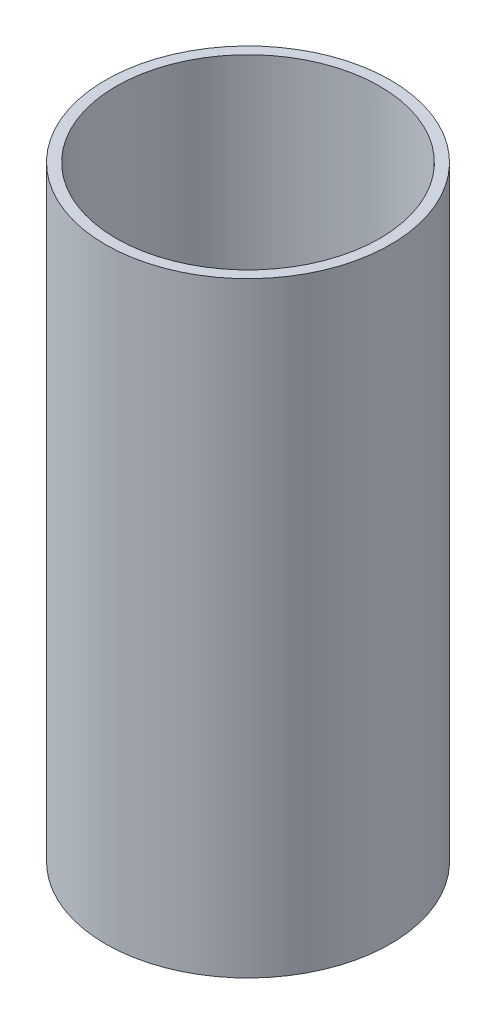
ISO-10303-21;
HEADER;
FILE_DESCRIPTION(('STEP AP214'),'2;1');
FILE_NAME('part.step','',(''),(''),'','','');
FILE_SCHEMA(('AUTOMOTIVE_DESIGN { 1 0 10303 214 1 1 1 1 }'));
ENDSEC;
DATA;
#1=APPLICATION_CONTEXT('core data for automotive mechanical design processes');
#2=APPLICATION_PROTOCOL_DEFINITION('international standard','automotive_design',2000,#1);
#3=PRODUCT_CONTEXT('',#1,'mechanical');
#4=PRODUCT('Part','Part','',(#3));
#5=PRODUCT_RELATED_PRODUCT_CATEGORY('part','',(#4));
#6=PRODUCT_DEFINITION_FORMATION('','',#4);
#7=PRODUCT_DEFINITION_CONTEXT('part definition',#1,'design');
#8=PRODUCT_DEFINITION('design','',#6,#7);
#9=PRODUCT_DEFINITION_SHAPE('','',#8);
#10=(LENGTH_UNIT() NAMED_UNIT(*) SI_UNIT(.MILLI.,.METRE.));
#11=(NAMED_UNIT(*) PLANE_ANGLE_UNIT() SI_UNIT($,.RADIAN.));
#12=(NAMED_UNIT(*) SI_UNIT($,.STERADIAN.) SOLID_ANGLE_UNIT());
#13=UNCERTAINTY_MEASURE_WITH_UNIT(LENGTH_MEASURE(1.E-05),#10,'distance_accuracy_value','');
#14=(GEOMETRIC_REPRESENTATION_CONTEXT(3) GLOBAL_UNCERTAINTY_ASSIGNED_CONTEXT((#13)) GLOBAL_UNIT_ASSIGNED_CONTEXT((#10,
#11,#12)) REPRESENTATION_CONTEXT('',''));
#15=CARTESIAN_POINT('',(0.,0.,0.));
#16=DIRECTION('',(0.,0.,1.));
#17=DIRECTION('',(1.,0.,0.));
#18=AXIS2_PLACEMENT_3D('',#15,#16,#17);
#19=CARTESIAN_POINT('',(0.,5.,0.));
#20=DIRECTION('',(0.,1.,0.));
#21=DIRECTION('',(0.,0.,1.));
#22=AXIS2_PLACEMENT_3D('',#19,#20,#21);
#23=PLANE('',#22);
#24=CARTESIAN_POINT('',(0.398916908497065,5.,16.595357005529));
#25=DIRECTION('',(0.,1.,0.));
#26=DIRECTION('',(0.,0.,1.));
#27=AXIS2_PLACEMENT_3D('',#24,#25,#26);
#28=CIRCLE('',#27,1.90000000000001);
#29=CARTESIAN_POINT('',(2.25443444347127,5.,17.0040802338917));
#30=VERTEX_POINT('',#29);
#31=CARTESIAN_POINT('',(0.469844501519903,5.,18.4941998427255));
#32=VERTEX_POINT('',#31);
#33=EDGE_CURVE('E229',#30,#32,#28,.F.);
#34=ORIENTED_EDGE('',*,*,#33,.T.);
#35=CARTESIAN_POINT('',(0.469848724395843,5.,18.4943668611181));
#36=CARTESIAN_POINT('',(3.89713423204612,5.,18.4100052235027));
#37=CARTESIAN_POINT('',(7.07969530398099,5.,17.09189642034));
#38=CARTESIAN_POINT('',(10.4788490474181,5.,15.6840822822113));
#39=CARTESIAN_POINT('',(13.0815711755286,5.,13.0815711755286));
#40=CARTESIAN_POINT('',(15.683232600443,5.,10.4801206860432));
#41=CARTESIAN_POINT('',(17.09189642034,5.,7.079695303981));
#42=CARTESIAN_POINT('',(18.4999861588976,5.,3.68065571796918));
#43=CARTESIAN_POINT('',(18.5001353735815,5.,0.));
#44=CARTESIAN_POINT('',(18.5001415821043,5.,-0.153144678180571));
#45=CARTESIAN_POINT('',(18.4977073074384,5.,-0.305806615858073));
#46=B_SPLINE_CURVE_WITH_KNOTS('',2,(#35,#36,#37,#38,#39,#40,#41,#42,#43,#44,#45),.UNSPECIFIED.,
.F.,.F.,(3,2,2,2,2,3),(0.00400012680160524,0.0625,0.125,0.1875,0.25,0.252601559466381),.UNSPECIFIED.);
#47=CARTESIAN_POINT('',(18.4975981453206,5.,-0.309440726557622));
#48=VERTEX_POINT('',#47);
#49=EDGE_CURVE('E11',#32,#48,#46,.T.);
#50=ORIENTED_EDGE('',*,*,#49,.T.);
#51=CARTESIAN_POINT('',(16.5977970247013,5.,-0.275511549903154));
#52=DIRECTION('',(0.,1.,0.));
#53=DIRECTION('',(0.,0.,1.));
#54=AXIS2_PLACEMENT_3D('',#51,#52,#53);
#55=CIRCLE('',#54,1.90000000000001);
#56=CARTESIAN_POINT('',(17.0755900825332,5.,1.56343211260737));
#57=VERTEX_POINT('',#56);
#58=EDGE_CURVE('E310',#57,#48,#55,.T.);
#59=ORIENTED_EDGE('',*,*,#58,.F.);
#60=DIRECTION('',(0.967865085531852,0.,-0.251470030437865));
#61=VECTOR('',#60,1.);
#62=CARTESIAN_POINT('',(1.46033437511065,5.,5.62057694274947));
#63=LINE('',#62,#61);
#64=CARTESIAN_POINT('',(7.92865759356696,5.,3.93998172246282));
#65=VERTEX_POINT('',#64);
#66=EDGE_CURVE('E313',#65,#57,#63,.T.);
#67=ORIENTED_EDGE('',*,*,#66,.F.);
#68=CARTESIAN_POINT('',(9.18600774575628,5.,8.77930715012208));
#69=DIRECTION('',(0.,1.,0.));
#70=DIRECTION('',(0.,0.,1.));
#71=AXIS2_PLACEMENT_3D('',#68,#69,#70);
#72=CIRCLE('',#71,5.);
#73=CARTESIAN_POINT('',(4.3030668642452,5.,7.70371970706235));
#74=VERTEX_POINT('',#73);
#75=EDGE_CURVE('E399',#65,#74,#72,.T.);
#76=ORIENTED_EDGE('',*,*,#75,.T.);
#77=DIRECTION('',(-0.215117488611946,0.,0.976588176302217));
#78=VECTOR('',#77,1.);
#79=CARTESIAN_POINT('',(5.72234679655976,5.,1.26048717536552));
#80=LINE('',#79,#78);
#81=EDGE_CURVE('E639',#74,#30,#80,.T.);
#82=ORIENTED_EDGE('',*,*,#81,.T.);
#83=EDGE_LOOP('',(#34,#50,#59,#67,#76,#82));
#84=FACE_BOUND('',#83,.T.);
#85=ADVANCED_FACE('F35',(#84),#23,.T.);
#86=CARTESIAN_POINT('',(16.595357005529,5.,-0.398916908497127));
#87=DIRECTION('',(0.,1.,0.));
#88=DIRECTION('',(0.,0.,1.));
#89=AXIS2_PLACEMENT_3D('',#86,#87,#88);
#90=CIRCLE('',#89,1.90000000000002);
#91=CARTESIAN_POINT('',(17.0040802338917,5.,-2.25443444347133));
#92=VERTEX_POINT('',#91);
#93=CARTESIAN_POINT('',(18.4942082430077,5.,-0.469844686806047));
#94=VERTEX_POINT('',#93);
#95=EDGE_CURVE('E361',#92,#94,#90,.F.);
#96=ORIENTED_EDGE('',*,*,#95,.T.);
#97=CARTESIAN_POINT('',(18.4943836608976,5.,-0.469849126999993));
#98=CARTESIAN_POINT('',(18.4101364550359,5.,-3.896817374775));
#99=CARTESIAN_POINT('',(17.09189642034,5.,-7.07969530398099));
#100=CARTESIAN_POINT('',(15.6840822822053,5.,-10.4788490474242));
#101=CARTESIAN_POINT('',(13.0815711755286,5.,-13.0815711755286));
#102=CARTESIAN_POINT('',(10.4801206860512,5.,-15.683232600435));
#103=CARTESIAN_POINT('',(7.079695303981,5.,-17.09189642034));
#104=CARTESIAN_POINT('',(3.68065571798048,5.,-18.4999861588976));
#105=CARTESIAN_POINT('',(0.,5.,-18.5001353735815));
#106=CARTESIAN_POINT('',(-0.15314467860857,5.,-18.5001415821043));
#107=CARTESIAN_POINT('',(-0.305806616711385,5.,-18.4977073074248));
#108=B_SPLINE_CURVE_WITH_KNOTS('',2,(#97,#98,#99,#100,#101,#102,#103,#104,#105,#106,#107),
.UNSPECIFIED.,.F.,.F.,(3,2,2,2,2,3),(0.254000498511549,0.3125,0.375,0.4375,0.5,
0.502601559473654),.UNSPECIFIED.);
#109=CARTESIAN_POINT('',(-0.309440726984137,5.,-18.4975981453136));
#110=VERTEX_POINT('',#109);
#111=EDGE_CURVE('E46',#94,#110,#108,.T.);
#112=ORIENTED_EDGE('',*,*,#111,.T.);
#113=CARTESIAN_POINT('',(-0.275511549903212,5.,-16.5977970247013));
#114=DIRECTION('',(0.,1.,0.));
#115=DIRECTION('',(0.,0.,1.));
#116=AXIS2_PLACEMENT_3D('',#113,#114,#115);
#117=CIRCLE('',#116,1.90000000000002);
#118=CARTESIAN_POINT('',(1.56343211260731,5.,-17.0755900825332));
#119=VERTEX_POINT('',#118);
#120=EDGE_CURVE('E532',#119,#110,#117,.T.);
#121=ORIENTED_EDGE('',*,*,#120,.F.);
#122=DIRECTION('',(-0.251470030437871,0.,-0.967865085531851));
#123=VECTOR('',#122,1.);
#124=CARTESIAN_POINT('',(5.6205769427495,5.,-1.46033437511069));
#125=LINE('',#124,#123);
#126=CARTESIAN_POINT('',(3.93998172246282,5.,-7.92865759356695));
#127=VERTEX_POINT('',#126);
#128=EDGE_CURVE('E567',#127,#119,#125,.T.);
#129=ORIENTED_EDGE('',*,*,#128,.F.);
#130=CARTESIAN_POINT('',(8.77930715012208,5.,-9.1860077457563));
#131=DIRECTION('',(0.,1.,0.));
#132=DIRECTION('',(0.,0.,1.));
#133=AXIS2_PLACEMENT_3D('',#130,#131,#132);
#134=CIRCLE('',#133,5.);
#135=CARTESIAN_POINT('',(7.70371970706237,5.,-4.30306686424521));
#136=VERTEX_POINT('',#135);
#137=EDGE_CURVE('E397',#127,#136,#134,.T.);
#138=ORIENTED_EDGE('',*,*,#137,.T.);
#139=DIRECTION('',(0.976588176302218,0.,0.215117488611942));
#140=VECTOR('',#139,1.);
#141=CARTESIAN_POINT('',(1.2604871753655,5.,-5.72234679655975));
#142=LINE('',#141,#140);
#143=EDGE_CURVE('E365',#136,#92,#142,.T.);
#144=ORIENTED_EDGE('',*,*,#143,.T.);
#145=EDGE_LOOP('',(#96,#112,#121,#129,#138,#144));
#146=FACE_BOUND('',#145,.T.);
#147=ADVANCED_FACE('F468',(#146),#23,.T.);
#148=CARTESIAN_POINT('',(-0.398916908497125,5.,-16.5953570055291));
#149=DIRECTION('',(0.,1.,0.));
#150=DIRECTION('',(0.,0.,1.));
#151=AXIS2_PLACEMENT_3D('',#148,#149,#150);
#152=CIRCLE('',#151,1.9);
#153=CARTESIAN_POINT('',(-2.25443444347133,5.,-17.0040802338918));
#154=VERTEX_POINT('',#153);
#155=CARTESIAN_POINT('',(-0.469844686811403,5.,-18.4942082430076));
#156=VERTEX_POINT('',#155);
#157=EDGE_CURVE('E531',#154,#156,#152,.F.);
#158=ORIENTED_EDGE('',*,*,#157,.T.);
#159=CARTESIAN_POINT('',(-0.46984912700534,5.,-18.4943836608975));
#160=CARTESIAN_POINT('',(-3.89681737477497,5.,-18.4101364550348));
#161=CARTESIAN_POINT('',(-7.07969530398099,5.,-17.09189642034));
#162=CARTESIAN_POINT('',(-10.4788490474149,5.,-15.6840822822103));
#163=CARTESIAN_POINT('',(-13.0815711755286,5.,-13.0815711755286));
#164=CARTESIAN_POINT('',(-15.683232600451,5.,-10.4801206860394));
#165=CARTESIAN_POINT('',(-17.09189642034,5.,-7.079695303981));
#166=CARTESIAN_POINT('',(-18.4999861588976,5.,-3.68065571795362));
#167=CARTESIAN_POINT('',(-18.5001353735815,5.,0.));
#168=CARTESIAN_POINT('',(-18.5001415821043,5.,0.153144678173017));
#169=CARTESIAN_POINT('',(-18.4977073074387,5.,0.305806615842921));
#170=B_SPLINE_CURVE_WITH_KNOTS('',2,(#159,#160,#161,#162,#163,#164,#165,#166,#167,#168,#169),
.UNSPECIFIED.,.F.,.F.,(3,2,2,2,2,3),(0.504000498511598,0.5625,0.625,0.6875,0.75,
0.752601559466232),.UNSPECIFIED.);
#171=CARTESIAN_POINT('',(-18.4975981453207,5.,0.309440726550006));
#172=VERTEX_POINT('',#171);
#173=EDGE_CURVE('E661',#156,#172,#170,.T.);
#174=ORIENTED_EDGE('',*,*,#173,.T.);
#175=CARTESIAN_POINT('',(-16.5977970247013,5.,0.27551154990327));
#176=DIRECTION('',(0.,1.,0.));
#177=DIRECTION('',(0.,0.,1.));
#178=AXIS2_PLACEMENT_3D('',#175,#176,#177);
#179=CIRCLE('',#178,1.90000000000004);
#180=CARTESIAN_POINT('',(-17.0755900825332,5.,-1.56343211260725));
#181=VERTEX_POINT('',#180);
#182=EDGE_CURVE('E648',#181,#172,#179,.T.);
#183=ORIENTED_EDGE('',*,*,#182,.F.);
#184=DIRECTION('',(-0.967865085531849,0.,0.251470030437875));
#185=VECTOR('',#184,1.);
#186=CARTESIAN_POINT('',(-1.46033437511072,5.,-5.62057694274951));
#187=LINE('',#186,#185);
#188=CARTESIAN_POINT('',(-7.92865759356693,5.,-3.93998172246281));
#189=VERTEX_POINT('',#188);
#190=EDGE_CURVE('E538',#189,#181,#187,.T.);
#191=ORIENTED_EDGE('',*,*,#190,.F.);
#192=CARTESIAN_POINT('',(-9.18600774575631,5.,-8.77930715012206));
#193=DIRECTION('',(0.,1.,0.));
#194=DIRECTION('',(0.,0.,1.));
#195=AXIS2_PLACEMENT_3D('',#192,#193,#194);
#196=CIRCLE('',#195,5.);
#197=CARTESIAN_POINT('',(-4.30306686424522,5.,-7.70371970706236));
#198=VERTEX_POINT('',#197);
#199=EDGE_CURVE('E401',#189,#198,#196,.T.);
#200=ORIENTED_EDGE('',*,*,#199,.T.);
#201=DIRECTION('',(0.215117488611941,0.,-0.976588176302218));
#202=VECTOR('',#201,1.);
#203=CARTESIAN_POINT('',(-5.72234679655975,5.,-1.26048717536549));
#204=LINE('',#203,#202);
#205=EDGE_CURVE('E534',#198,#154,#204,.T.);
#206=ORIENTED_EDGE('',*,*,#205,.T.);
#207=EDGE_LOOP('',(#158,#174,#183,#191,#200,#206));
#208=FACE_BOUND('',#207,.T.);
#209=ADVANCED_FACE('F475',(#208),#23,.T.);
#210=CARTESIAN_POINT('',(-16.5953570055291,5.,0.398916908497061));
#211=DIRECTION('',(0.,1.,0.));
#212=DIRECTION('',(0.,0.,1.));
#213=AXIS2_PLACEMENT_3D('',#210,#211,#212);
#214=CIRCLE('',#213,1.90000000000001);
#215=CARTESIAN_POINT('',(-17.0040802338918,5.,2.25443444347127));
#216=VERTEX_POINT('',#215);
#217=CARTESIAN_POINT('',(-18.4950051459864,5.00000000000001,0.439698565779146));
#218=VERTEX_POINT('',#217);
#219=EDGE_CURVE('E494',#216,#218,#214,.F.);
#220=ORIENTED_EDGE('',*,*,#219,.T.);
#221=CARTESIAN_POINT('',(-18.495174579785,5.,0.436481423164717));
#222=CARTESIAN_POINT('',(-18.4119243450738,5.,4.08413422044468));
#223=CARTESIAN_POINT('',(-16.9334326102457,5.,7.45117091445404));
#224=CARTESIAN_POINT('',(-15.4662980923971,5.,10.7923432999854));
#225=CARTESIAN_POINT('',(-12.8165681772887,5.,13.3415071287079));
#226=CARTESIAN_POINT('',(-10.1862268144008,5.,15.872018265422));
#227=CARTESIAN_POINT('',(-6.76576815431525,5.,17.2187060575788));
#228=CARTESIAN_POINT('',(-3.36810624443425,5.,18.5564184144937));
#229=CARTESIAN_POINT('',(0.305878855076814,5.,18.4976947119114));
#230=B_SPLINE_CURVE_WITH_KNOTS('',2,(#221,#222,#223,#224,#225,#226,#227,#228,#229),
.UNSPECIFIED.,.F.,.F.,(3,2,2,2,3),(0.,0.25,0.5,0.75,1.),.UNSPECIFIED.);
#231=CARTESIAN_POINT('',(0.309476782501093,5.,18.4975917693016));
#232=VERTEX_POINT('',#231);
#233=EDGE_CURVE('E426',#218,#232,#230,.T.);
#234=ORIENTED_EDGE('',*,*,#233,.T.);
#235=CARTESIAN_POINT('',(0.275511549903097,5.,16.5977970247013));
#236=DIRECTION('',(0.,1.,0.));
#237=DIRECTION('',(0.,0.,1.));
#238=AXIS2_PLACEMENT_3D('',#235,#236,#237);
#239=CIRCLE('',#238,1.89999999999999);
#240=CARTESIAN_POINT('',(-1.56343211260743,5.,17.0755900825332));
#241=VERTEX_POINT('',#240);
#242=EDGE_CURVE('E246',#241,#232,#239,.T.);
#243=ORIENTED_EDGE('',*,*,#242,.F.);
#244=DIRECTION('',(0.251470030437862,0.,0.967865085531853));
#245=VECTOR('',#244,1.);
#246=CARTESIAN_POINT('',(-5.62057694274948,5.,1.46033437511063));
#247=LINE('',#246,#245);
#248=CARTESIAN_POINT('',(-3.93998172246285,5.,7.92865759356695));
#249=VERTEX_POINT('',#248);
#250=EDGE_CURVE('E646',#249,#241,#247,.T.);
#251=ORIENTED_EDGE('',*,*,#250,.F.);
#252=CARTESIAN_POINT('',(-8.77930715012212,5.,9.18600774575627));
#253=DIRECTION('',(0.,1.,0.));
#254=DIRECTION('',(0.,0.,1.));
#255=AXIS2_PLACEMENT_3D('',#252,#253,#254);
#256=CIRCLE('',#255,5.);
#257=CARTESIAN_POINT('',(-7.7037197070624,5.,4.30306686424518));
#258=VERTEX_POINT('',#257);
#259=EDGE_CURVE('E403',#249,#258,#256,.T.);
#260=ORIENTED_EDGE('',*,*,#259,.T.);
#261=DIRECTION('',(-0.976588176302217,0.,-0.215117488611944));
#262=VECTOR('',#261,1.);
#263=CARTESIAN_POINT('',(-1.26048717536551,5.,5.72234679655974));
#264=LINE('',#263,#262);
#265=EDGE_CURVE('E499',#258,#216,#264,.T.);
#266=ORIENTED_EDGE('',*,*,#265,.T.);
#267=EDGE_LOOP('',(#220,#234,#243,#251,#260,#266));
#268=FACE_BOUND('',#267,.T.);
#269=ADVANCED_FACE('F470',(#268),#23,.T.);
#270=CARTESIAN_POINT('',(0.,2.5,0.));
#271=DIRECTION('',(0.,1.,0.));
#272=DIRECTION('',(0.,0.,1.));
#273=AXIS2_PLACEMENT_3D('',#270,#271,#272);
#274=PLANE('',#273);
#275=CARTESIAN_POINT('',(0.,2.5,0.));
#276=DIRECTION('',(0.,1.,0.));
#277=DIRECTION('',(0.,0.,1.));
#278=AXIS2_PLACEMENT_3D('',#275,#276,#277);
#279=CIRCLE('',#278,4.7);
#280=CARTESIAN_POINT('',(0.,2.5,4.7));
#281=VERTEX_POINT('',#280);
#282=EDGE_CURVE('E382',#281,#281,#279,.T.);
#283=ORIENTED_EDGE('',*,*,#282,.F.);
#284=EDGE_LOOP('',(#283));
#285=FACE_BOUND('',#284,.T.);
#286=DIRECTION('',(0.976588176302218,0.,0.215117488611942));
#287=VECTOR('',#286,1.);
#288=CARTESIAN_POINT('',(1.2604871753655,2.5,-5.72234679655975));
#289=LINE('',#288,#287);
#290=CARTESIAN_POINT('',(7.70371970706237,2.5,-4.30306686424521));
#291=VERTEX_POINT('',#290);
#292=CARTESIAN_POINT('',(17.0040802338917,2.5,-2.25443444347133));
#293=VERTEX_POINT('',#292);
#294=EDGE_CURVE('E579',#291,#293,#289,.T.);
#295=ORIENTED_EDGE('',*,*,#294,.F.);
#296=CARTESIAN_POINT('',(8.77930715012208,2.5,-9.1860077457563));
#297=DIRECTION('',(0.,1.,0.));
#298=DIRECTION('',(0.,0.,1.));
#299=AXIS2_PLACEMENT_3D('',#296,#297,#298);
#300=CIRCLE('',#299,5.);
#301=CARTESIAN_POINT('',(3.93998172246282,2.5,-7.92865759356695));
#302=VERTEX_POINT('',#301);
#303=EDGE_CURVE('E53',#291,#302,#300,.F.);
#304=ORIENTED_EDGE('',*,*,#303,.T.);
#305=DIRECTION('',(-0.251470030437871,0.,-0.967865085531851));
#306=VECTOR('',#305,1.);
#307=CARTESIAN_POINT('',(5.6205769427495,2.5,-1.46033437511069));
#308=LINE('',#307,#306);
#309=CARTESIAN_POINT('',(1.56343211260731,2.5,-17.0755900825332));
#310=VERTEX_POINT('',#309);
#311=EDGE_CURVE('E623',#302,#310,#308,.T.);
#312=ORIENTED_EDGE('',*,*,#311,.T.);
#313=CARTESIAN_POINT('',(-0.275511549903212,2.5,-16.5977970247013));
#314=DIRECTION('',(0.,1.,0.));
#315=DIRECTION('',(0.,0.,1.));
#316=AXIS2_PLACEMENT_3D('',#313,#314,#315);
#317=CIRCLE('',#316,1.90000000000002);
#318=CARTESIAN_POINT('',(-0.31307175411364,2.5,-18.4974257334388));
#319=VERTEX_POINT('',#318);
#320=EDGE_CURVE('E621',#310,#319,#317,.T.);
#321=ORIENTED_EDGE('',*,*,#320,.T.);
#322=DIRECTION('',(0.999804583546048,0.,-0.0197685285318369));
#323=VECTOR('',#322,1.);
#324=CARTESIAN_POINT('',(-0.365717777838952,2.5,-18.4963847956003));
#325=LINE('',#324,#323);
#326=CARTESIAN_POINT('',(-0.365717777839752,2.5,-18.4963847956003));
#327=VERTEX_POINT('',#326);
#328=EDGE_CURVE('E618',#327,#319,#325,.T.);
#329=ORIENTED_EDGE('',*,*,#328,.F.);
#330=CARTESIAN_POINT('',(0.,2.5,0.));
#331=DIRECTION('',(0.,1.,0.));
#332=DIRECTION('',(0.,0.,1.));
#333=AXIS2_PLACEMENT_3D('',#330,#331,#332);
#334=CIRCLE('',#333,18.5);
#335=CARTESIAN_POINT('',(-0.469840502049203,2.5,-18.4940328187941));
#336=VERTEX_POINT('',#335);
#337=EDGE_CURVE('E587',#327,#336,#334,.T.);
#338=ORIENTED_EDGE('',*,*,#337,.T.);
#339=CARTESIAN_POINT('',(-0.398916908497125,2.5,-16.5953570055291));
#340=DIRECTION('',(0.,1.,0.));
#341=DIRECTION('',(0.,0.,1.));
#342=AXIS2_PLACEMENT_3D('',#339,#340,#341);
#343=CIRCLE('',#342,1.9);
#344=CARTESIAN_POINT('',(-2.25443444347133,2.5,-17.0040802338918));
#345=VERTEX_POINT('',#344);
#346=EDGE_CURVE('E616',#345,#336,#343,.F.);
#347=ORIENTED_EDGE('',*,*,#346,.F.);
#348=DIRECTION('',(0.215117488611941,0.,-0.976588176302218));
#349=VECTOR('',#348,1.);
#350=CARTESIAN_POINT('',(-5.72234679655975,2.5,-1.26048717536549));
#351=LINE('',#350,#349);
#352=CARTESIAN_POINT('',(-4.30306686424522,2.5,-7.70371970706236));
#353=VERTEX_POINT('',#352);
#354=EDGE_CURVE('E614',#353,#345,#351,.T.);
#355=ORIENTED_EDGE('',*,*,#354,.F.);
#356=CARTESIAN_POINT('',(-9.18600774575631,2.5,-8.77930715012206));
#357=DIRECTION('',(0.,1.,0.));
#358=DIRECTION('',(0.,0.,1.));
#359=AXIS2_PLACEMENT_3D('',#356,#357,#358);
#360=CIRCLE('',#359,5.);
#361=CARTESIAN_POINT('',(-7.92865759356693,2.5,-3.93998172246281));
#362=VERTEX_POINT('',#361);
#363=EDGE_CURVE('E421',#353,#362,#360,.F.);
#364=ORIENTED_EDGE('',*,*,#363,.T.);
#365=DIRECTION('',(-0.967865085531849,0.,0.251470030437875));
#366=VECTOR('',#365,1.);
#367=CARTESIAN_POINT('',(-1.46033437511072,2.5,-5.62057694274951));
#368=LINE('',#367,#366);
#369=CARTESIAN_POINT('',(-17.0755900825332,2.5,-1.56343211260725));
#370=VERTEX_POINT('',#369);
#371=EDGE_CURVE('E612',#362,#370,#368,.T.);
#372=ORIENTED_EDGE('',*,*,#371,.T.);
#373=CARTESIAN_POINT('',(-16.5977970247013,2.5,0.27551154990327));
#374=DIRECTION('',(0.,1.,0.));
#375=DIRECTION('',(0.,0.,1.));
#376=AXIS2_PLACEMENT_3D('',#373,#374,#375);
#377=CIRCLE('',#376,1.90000000000004);
#378=CARTESIAN_POINT('',(-18.4974257334388,2.5,0.313071754113599));
#379=VERTEX_POINT('',#378);
#380=EDGE_CURVE('E610',#370,#379,#377,.T.);
#381=ORIENTED_EDGE('',*,*,#380,.T.);
#382=DIRECTION('',(0.0197685285318852,0.,0.999804583546047));
#383=VECTOR('',#382,1.);
#384=CARTESIAN_POINT('',(-18.4963847956003,2.5,0.365717777839846));
#385=LINE('',#384,#383);
#386=CARTESIAN_POINT('',(-18.4949857142666,2.5,0.436477112707738));
#387=VERTEX_POINT('',#386);
#388=EDGE_CURVE('E608',#379,#387,#385,.T.);
#389=ORIENTED_EDGE('',*,*,#388,.T.);
#390=CARTESIAN_POINT('',(-16.5953570055291,2.5,0.398916908497061));
#391=DIRECTION('',(0.,1.,0.));
#392=DIRECTION('',(0.,0.,1.));
#393=AXIS2_PLACEMENT_3D('',#390,#391,#392);
#394=CIRCLE('',#393,1.90000000000001);
#395=CARTESIAN_POINT('',(-17.0040802338918,2.5,2.25443444347127));
#396=VERTEX_POINT('',#395);
#397=EDGE_CURVE('E506',#396,#387,#394,.F.);
#398=ORIENTED_EDGE('',*,*,#397,.F.);
#399=DIRECTION('',(-0.976588176302217,0.,-0.215117488611944));
#400=VECTOR('',#399,1.);
#401=CARTESIAN_POINT('',(-1.26048717536551,2.5,5.72234679655974));
#402=LINE('',#401,#400);
#403=CARTESIAN_POINT('',(-7.7037197070624,2.5,4.30306686424518));
#404=VERTEX_POINT('',#403);
#405=EDGE_CURVE('E605',#404,#396,#402,.T.);
#406=ORIENTED_EDGE('',*,*,#405,.F.);
#407=CARTESIAN_POINT('',(-8.77930715012212,2.5,9.18600774575627));
#408=DIRECTION('',(0.,1.,0.));
#409=DIRECTION('',(0.,0.,1.));
#410=AXIS2_PLACEMENT_3D('',#407,#408,#409);
#411=CIRCLE('',#410,5.);
#412=CARTESIAN_POINT('',(-3.93998172246285,2.5,7.92865759356695));
#413=VERTEX_POINT('',#412);
#414=EDGE_CURVE('E419',#404,#413,#411,.F.);
#415=ORIENTED_EDGE('',*,*,#414,.T.);
#416=DIRECTION('',(0.251470030437862,0.,0.967865085531853));
#417=VECTOR('',#416,1.);
#418=CARTESIAN_POINT('',(-5.62057694274948,2.5,1.46033437511063));
#419=LINE('',#418,#417);
#420=CARTESIAN_POINT('',(-1.56343211260743,2.5,17.0755900825332));
#421=VERTEX_POINT('',#420);
#422=EDGE_CURVE('E603',#413,#421,#419,.T.);
#423=ORIENTED_EDGE('',*,*,#422,.T.);
#424=CARTESIAN_POINT('',(0.275511549903097,2.5,16.5977970247013));
#425=DIRECTION('',(0.,1.,0.));
#426=DIRECTION('',(0.,0.,1.));
#427=AXIS2_PLACEMENT_3D('',#424,#425,#426);
#428=CIRCLE('',#427,1.89999999999999);
#429=CARTESIAN_POINT('',(0.313071754113643,2.5,18.4974257334387));
#430=VERTEX_POINT('',#429);
#431=EDGE_CURVE('E601',#421,#430,#428,.T.);
#432=ORIENTED_EDGE('',*,*,#431,.T.);
#433=DIRECTION('',(-0.999804583546048,0.,0.0197685285318369));
#434=VECTOR('',#433,1.);
#435=CARTESIAN_POINT('',(0.365717777838951,2.5,18.4963847956003));
#436=LINE('',#435,#434);
#437=CARTESIAN_POINT('',(0.365717777839755,2.5,18.4963847956002));
#438=VERTEX_POINT('',#437);
#439=EDGE_CURVE('E599',#438,#430,#436,.T.);
#440=ORIENTED_EDGE('',*,*,#439,.F.);
#441=CARTESIAN_POINT('',(0.469840502041634,2.5,18.4940328187943));
#442=VERTEX_POINT('',#441);
#443=EDGE_CURVE('E235',#438,#442,#334,.T.);
#444=ORIENTED_EDGE('',*,*,#443,.T.);
#445=CARTESIAN_POINT('',(0.398916908497065,2.5,16.595357005529));
#446=DIRECTION('',(0.,1.,0.));
#447=DIRECTION('',(0.,0.,1.));
#448=AXIS2_PLACEMENT_3D('',#445,#446,#447);
#449=CIRCLE('',#448,1.90000000000001);
#450=CARTESIAN_POINT('',(2.25443444347127,2.5,17.0040802338917));
#451=VERTEX_POINT('',#450);
#452=EDGE_CURVE('E596',#451,#442,#449,.F.);
#453=ORIENTED_EDGE('',*,*,#452,.F.);
#454=DIRECTION('',(-0.215117488611946,0.,0.976588176302217));
#455=VECTOR('',#454,1.);
#456=CARTESIAN_POINT('',(5.72234679655976,2.5,1.26048717536552));
#457=LINE('',#456,#455);
#458=CARTESIAN_POINT('',(4.3030668642452,2.5,7.70371970706235));
#459=VERTEX_POINT('',#458);
#460=EDGE_CURVE('E594',#459,#451,#457,.T.);
#461=ORIENTED_EDGE('',*,*,#460,.F.);
#462=CARTESIAN_POINT('',(9.18600774575628,2.5,8.77930715012208));
#463=DIRECTION('',(0.,1.,0.));
#464=DIRECTION('',(0.,0.,1.));
#465=AXIS2_PLACEMENT_3D('',#462,#463,#464);
#466=CIRCLE('',#465,5.);
#467=CARTESIAN_POINT('',(7.92865759356696,2.5,3.93998172246282));
#468=VERTEX_POINT('',#467);
#469=EDGE_CURVE('E423',#459,#468,#466,.F.);
#470=ORIENTED_EDGE('',*,*,#469,.T.);
#471=DIRECTION('',(0.967865085531852,0.,-0.251470030437865));
#472=VECTOR('',#471,1.);
#473=CARTESIAN_POINT('',(1.46033437511065,2.5,5.62057694274947));
#474=LINE('',#473,#472);
#475=CARTESIAN_POINT('',(17.0755900825332,2.5,1.56343211260737));
#476=VERTEX_POINT('',#475);
#477=EDGE_CURVE('E592',#468,#476,#474,.T.);
#478=ORIENTED_EDGE('',*,*,#477,.T.);
#479=CARTESIAN_POINT('',(16.5977970247013,2.5,-0.275511549903154));
#480=DIRECTION('',(0.,1.,0.));
#481=DIRECTION('',(0.,0.,1.));
#482=AXIS2_PLACEMENT_3D('',#479,#480,#481);
#483=CIRCLE('',#482,1.90000000000001);
#484=CARTESIAN_POINT('',(18.4974257334388,2.5,-0.313071754113674));
#485=VERTEX_POINT('',#484);
#486=EDGE_CURVE('E590',#476,#485,#483,.T.);
#487=ORIENTED_EDGE('',*,*,#486,.T.);
#488=DIRECTION('',(0.0197685285318369,0.,0.999804583546048));
#489=VECTOR('',#488,1.);
#490=CARTESIAN_POINT('',(18.4963847956003,2.5,-0.365717777838952));
#491=LINE('',#490,#489);
#492=CARTESIAN_POINT('',(18.4963847956003,2.5,-0.365717777839786));
#493=VERTEX_POINT('',#492);
#494=EDGE_CURVE('E586',#493,#485,#491,.T.);
#495=ORIENTED_EDGE('',*,*,#494,.F.);
#496=CARTESIAN_POINT('',(18.4940328187943,2.5,-0.469840502043847));
#497=VERTEX_POINT('',#496);
#498=EDGE_CURVE('E584',#493,#497,#334,.T.);
#499=ORIENTED_EDGE('',*,*,#498,.T.);
#500=CARTESIAN_POINT('',(16.595357005529,2.5,-0.398916908497127));
#501=DIRECTION('',(0.,1.,0.));
#502=DIRECTION('',(0.,0.,1.));
#503=AXIS2_PLACEMENT_3D('',#500,#501,#502);
#504=CIRCLE('',#503,1.90000000000002);
#505=EDGE_CURVE('E581',#293,#497,#504,.F.);
#506=ORIENTED_EDGE('',*,*,#505,.F.);
#507=EDGE_LOOP('',(#295,#304,#312,#321,#329,#338,#347,#355,#364,#372,#381,#389,#398,#406,#415,
#423,#432,#440,#444,#453,#461,#470,#478,#487,#495,#499,#506));
#508=FACE_BOUND('',#507,.T.);
#509=ADVANCED_FACE('F481',(#285,#508),#274,.T.);
#510=CARTESIAN_POINT('',(0.,0.,0.));
#511=DIRECTION('',(0.,1.,0.));
#512=DIRECTION('',(0.,0.,1.));
#513=AXIS2_PLACEMENT_3D('',#510,#511,#512);
#514=PLANE('',#513);
#515=CARTESIAN_POINT('',(0.,0.,0.));
#516=DIRECTION('',(0.,1.,0.));
#517=DIRECTION('',(0.,0.,1.));
#518=AXIS2_PLACEMENT_3D('',#515,#516,#517);
#519=CIRCLE('',#518,20.);
#520=CARTESIAN_POINT('',(0.,0.,20.));
#521=VERTEX_POINT('',#520);
#522=EDGE_CURVE('E388',#521,#521,#519,.T.);
#523=ORIENTED_EDGE('',*,*,#522,.F.);
#524=EDGE_LOOP('',(#523));
#525=FACE_BOUND('',#524,.T.);
#526=CARTESIAN_POINT('',(0.,0.,0.));
#527=DIRECTION('',(0.,1.,0.));
#528=DIRECTION('',(0.,0.,1.));
#529=AXIS2_PLACEMENT_3D('',#526,#527,#528);
#530=CIRCLE('',#529,4.7);
#531=CARTESIAN_POINT('',(0.,0.,4.7));
#532=VERTEX_POINT('',#531);
#533=EDGE_CURVE('E376',#532,#532,#530,.T.);
#534=ORIENTED_EDGE('',*,*,#533,.T.);
#535=EDGE_LOOP('',(#534));
#536=FACE_BOUND('',#535,.T.);
#537=ADVANCED_FACE('F488',(#525,#536),#514,.F.);
#538=CARTESIAN_POINT('',(0.,2.5,0.));
#539=DIRECTION('',(0.,-1.,0.));
#540=DIRECTION('',(0.,0.,-1.));
#541=AXIS2_PLACEMENT_3D('',#538,#539,#540);
#542=CYLINDRICAL_SURFACE('',#541,20.);
#543=ORIENTED_EDGE('',*,*,#522,.T.);
#544=EDGE_LOOP('',(#543));
#545=FACE_BOUND('',#544,.T.);
#546=CARTESIAN_POINT('',(0.,85.,0.));
#547=DIRECTION('',(0.,1.,0.));
#548=DIRECTION('',(0.,0.,1.));
#549=AXIS2_PLACEMENT_3D('',#546,#547,#548);
#550=CIRCLE('',#549,20.);
#551=CARTESIAN_POINT('',(0.,85.,20.));
#552=VERTEX_POINT('',#551);
#553=EDGE_CURVE('E582',#552,#552,#550,.T.);
#554=ORIENTED_EDGE('',*,*,#553,.F.);
#555=EDGE_LOOP('',(#554));
#556=FACE_BOUND('',#555,.T.);
#557=ADVANCED_FACE('F795',(#545,#556),#542,.T.);
#558=CARTESIAN_POINT('',(0.,2.5,0.));
#559=DIRECTION('',(0.,-1.,0.));
#560=DIRECTION('',(0.,0.,-1.));
#561=AXIS2_PLACEMENT_3D('',#558,#559,#560);
#562=CYLINDRICAL_SURFACE('',#561,4.7);
#563=ORIENTED_EDGE('',*,*,#282,.T.);
#564=EDGE_LOOP('',(#563));
#565=FACE_BOUND('',#564,.T.);
#566=ORIENTED_EDGE('',*,*,#533,.F.);
#567=EDGE_LOOP('',(#566));
#568=FACE_BOUND('',#567,.T.);
#569=ADVANCED_FACE('F860',(#565,#568),#562,.F.);
#570=CARTESIAN_POINT('',(1.2604871753655,5.,-5.72234679655975));
#571=DIRECTION('',(0.215117488611942,0.,-0.976588176302218));
#572=DIRECTION('',(-0.976588176302218,0.,-0.215117488611942));
#573=AXIS2_PLACEMENT_3D('',#570,#571,#572);
#574=PLANE('',#573);
#575=ORIENTED_EDGE('',*,*,#143,.F.);
#576=DIRECTION('',(0.,-1.,0.));
#577=VECTOR('',#576,1.);
#578=CARTESIAN_POINT('',(7.70371970706237,2.5,-4.30306686424521));
#579=LINE('',#578,#577);
#580=EDGE_CURVE('E415',#136,#291,#579,.T.);
#581=ORIENTED_EDGE('',*,*,#580,.T.);
#582=ORIENTED_EDGE('',*,*,#294,.T.);
#583=DIRECTION('',(0.,-1.,0.));
#584=VECTOR('',#583,1.);
#585=CARTESIAN_POINT('',(17.0040802338917,5.,-2.25443444347133));
#586=LINE('',#585,#584);
#587=EDGE_CURVE('E369',#92,#293,#586,.T.);
#588=ORIENTED_EDGE('',*,*,#587,.F.);
#589=EDGE_LOOP('',(#575,#581,#582,#588));
#590=FACE_BOUND('',#589,.T.);
#591=ADVANCED_FACE('F757',(#590),#574,.F.);
#592=CARTESIAN_POINT('',(16.595357005529,5.,-0.398916908497127));
#593=DIRECTION('',(0.,-1.,0.));
#594=DIRECTION('',(0.,0.,-1.));
#595=AXIS2_PLACEMENT_3D('',#592,#593,#594);
#596=CYLINDRICAL_SURFACE('',#595,1.90000000000002);
#597=ORIENTED_EDGE('',*,*,#505,.T.);
#598=DIRECTION('',(0.,-1.,0.));
#599=VECTOR('',#598,1.);
#600=CARTESIAN_POINT('',(18.4940328187943,5.,-0.469840502043847));
#601=LINE('',#600,#599);
#602=EDGE_CURVE('E358',#94,#497,#601,.T.);
#603=ORIENTED_EDGE('',*,*,#602,.F.);
#604=ORIENTED_EDGE('',*,*,#95,.F.);
#605=ORIENTED_EDGE('',*,*,#587,.T.);
#606=EDGE_LOOP('',(#597,#603,#604,#605));
#607=FACE_BOUND('',#606,.T.);
#608=ADVANCED_FACE('F289',(#607),#596,.F.);
#609=CARTESIAN_POINT('',(0.,5.,0.));
#610=DIRECTION('',(0.,-1.,0.));
#611=DIRECTION('',(0.,0.,-1.));
#612=AXIS2_PLACEMENT_3D('',#609,#610,#611);
#613=CYLINDRICAL_SURFACE('',#612,18.5);
#614=ORIENTED_EDGE('',*,*,#498,.F.);
#615=DIRECTION('',(0.,-1.,0.));
#616=VECTOR('',#615,1.);
#617=CARTESIAN_POINT('',(18.4963847956003,5.,-0.365717777839786));
#618=LINE('',#617,#616);
#619=CARTESIAN_POINT('',(18.4965211851855,5.,-0.365720320050597));
#620=VERTEX_POINT('',#619);
#621=EDGE_CURVE('E306',#620,#493,#618,.T.);
#622=ORIENTED_EDGE('',*,*,#621,.F.);
#623=CARTESIAN_POINT('',(0.,5.,0.));
#624=DIRECTION('',(0.,1.,0.));
#625=DIRECTION('',(0.999804583546047,0.,-0.0197685285318821));
#626=AXIS2_PLACEMENT_3D('',#623,#624,#625);
#627=CIRCLE('',#626,18.5);
#628=EDGE_CURVE('E364',#620,#94,#627,.T.);
#629=ORIENTED_EDGE('',*,*,#628,.T.);
#630=ORIENTED_EDGE('',*,*,#602,.T.);
#631=EDGE_LOOP('',(#614,#622,#629,#630));
#632=FACE_BOUND('',#631,.T.);
#633=ADVANCED_FACE('F287',(#632),#613,.F.);
#634=CARTESIAN_POINT('',(18.4963847956003,5.,-0.365717777838952));
#635=DIRECTION('',(0.999804583546048,0.,-0.0197685285318369));
#636=DIRECTION('',(-0.0197685285318369,0.,-0.999804583546048));
#637=AXIS2_PLACEMENT_3D('',#634,#635,#636);
#638=PLANE('',#637);
#639=ORIENTED_EDGE('',*,*,#494,.T.);
#640=DIRECTION('',(0.,-1.,0.));
#641=VECTOR('',#640,1.);
#642=CARTESIAN_POINT('',(18.4974257334388,5.,-0.313071754113674));
#643=LINE('',#642,#641);
#644=EDGE_CURVE('E298',#48,#485,#643,.T.);
#645=ORIENTED_EDGE('',*,*,#644,.F.);
#646=CARTESIAN_POINT('',(0.,5.,0.));
#647=DIRECTION('',(0.,-1.,0.));
#648=DIRECTION('',(0.999804583793068,0.,-0.0197685160386592));
#649=AXIS2_PLACEMENT_3D('',#646,#647,#648);
#650=CIRCLE('',#649,18.5001353735815);
#651=EDGE_CURVE('E314',#620,#48,#650,.T.);
#652=ORIENTED_EDGE('',*,*,#651,.F.);
#653=ORIENTED_EDGE('',*,*,#621,.T.);
#654=EDGE_LOOP('',(#639,#645,#652,#653));
#655=FACE_BOUND('',#654,.T.);
#656=ADVANCED_FACE('F282',(#655),#638,.F.);
#657=CARTESIAN_POINT('',(16.5977970247013,5.,-0.275511549903154));
#658=DIRECTION('',(0.,-1.,0.));
#659=DIRECTION('',(0.,0.,-1.));
#660=AXIS2_PLACEMENT_3D('',#657,#658,#659);
#661=CYLINDRICAL_SURFACE('',#660,1.90000000000001);
#662=ORIENTED_EDGE('',*,*,#486,.F.);
#663=DIRECTION('',(0.,-1.,0.));
#664=VECTOR('',#663,1.);
#665=CARTESIAN_POINT('',(17.0755900825332,5.,1.56343211260737));
#666=LINE('',#665,#664);
#667=EDGE_CURVE('E307',#57,#476,#666,.T.);
#668=ORIENTED_EDGE('',*,*,#667,.F.);
#669=ORIENTED_EDGE('',*,*,#58,.T.);
#670=ORIENTED_EDGE('',*,*,#644,.T.);
#671=EDGE_LOOP('',(#662,#668,#669,#670));
#672=FACE_BOUND('',#671,.T.);
#673=ADVANCED_FACE('F278',(#672),#661,.F.);
#674=CARTESIAN_POINT('',(1.46033437511065,5.,5.62057694274947));
#675=DIRECTION('',(-0.251470030437865,0.,-0.967865085531852));
#676=DIRECTION('',(-0.967865085531852,0.,0.251470030437865));
#677=AXIS2_PLACEMENT_3D('',#674,#675,#676);
#678=PLANE('',#677);
#679=ORIENTED_EDGE('',*,*,#477,.F.);
#680=DIRECTION('',(0.,-1.,0.));
#681=VECTOR('',#680,1.);
#682=CARTESIAN_POINT('',(7.92865759356696,5.,3.93998172246282));
#683=LINE('',#682,#681);
#684=EDGE_CURVE('E413',#468,#65,#683,.F.);
#685=ORIENTED_EDGE('',*,*,#684,.T.);
#686=ORIENTED_EDGE('',*,*,#66,.T.);
#687=ORIENTED_EDGE('',*,*,#667,.T.);
#688=EDGE_LOOP('',(#679,#685,#686,#687));
#689=FACE_BOUND('',#688,.T.);
#690=ADVANCED_FACE('F274',(#689),#678,.T.);
#691=CARTESIAN_POINT('',(5.72234679655976,5.,1.26048717536552));
#692=DIRECTION('',(0.976588176302217,0.,0.215117488611946));
#693=DIRECTION('',(0.215117488611946,0.,-0.976588176302217));
#694=AXIS2_PLACEMENT_3D('',#691,#692,#693);
#695=PLANE('',#694);
#696=ORIENTED_EDGE('',*,*,#81,.F.);
#697=DIRECTION('',(0.,-1.,0.));
#698=VECTOR('',#697,1.);
#699=CARTESIAN_POINT('',(4.3030668642452,2.5,7.70371970706235));
#700=LINE('',#699,#698);
#701=EDGE_CURVE('E410',#74,#459,#700,.T.);
#702=ORIENTED_EDGE('',*,*,#701,.T.);
#703=ORIENTED_EDGE('',*,*,#460,.T.);
#704=DIRECTION('',(0.,-1.,0.));
#705=VECTOR('',#704,1.);
#706=CARTESIAN_POINT('',(2.25443444347127,5.,17.0040802338917));
#707=LINE('',#706,#705);
#708=EDGE_CURVE('E630',#30,#451,#707,.T.);
#709=ORIENTED_EDGE('',*,*,#708,.F.);
#710=EDGE_LOOP('',(#696,#702,#703,#709));
#711=FACE_BOUND('',#710,.T.);
#712=ADVANCED_FACE('F270',(#711),#695,.F.);
#713=CARTESIAN_POINT('',(0.398916908497065,5.,16.595357005529));
#714=DIRECTION('',(0.,-1.,0.));
#715=DIRECTION('',(0.,0.,-1.));
#716=AXIS2_PLACEMENT_3D('',#713,#714,#715);
#717=CYLINDRICAL_SURFACE('',#716,1.90000000000001);
#718=ORIENTED_EDGE('',*,*,#452,.T.);
#719=DIRECTION('',(0.,-1.,0.));
#720=VECTOR('',#719,1.);
#721=CARTESIAN_POINT('',(0.469840502041634,5.,18.4940328187943));
#722=LINE('',#721,#720);
#723=EDGE_CURVE('E238',#32,#442,#722,.T.);
#724=ORIENTED_EDGE('',*,*,#723,.F.);
#725=ORIENTED_EDGE('',*,*,#33,.F.);
#726=ORIENTED_EDGE('',*,*,#708,.T.);
#727=EDGE_LOOP('',(#718,#724,#725,#726));
#728=FACE_BOUND('',#727,.T.);
#729=ADVANCED_FACE('F267',(#728),#717,.F.);
#730=ORIENTED_EDGE('',*,*,#443,.F.);
#731=DIRECTION('',(0.,-1.,0.));
#732=VECTOR('',#731,1.);
#733=CARTESIAN_POINT('',(0.365717777839755,5.,18.4963847956002));
#734=LINE('',#733,#732);
#735=CARTESIAN_POINT('',(0.365720205614039,5.,18.4965144559356));
#736=VERTEX_POINT('',#735);
#737=EDGE_CURVE('E233',#736,#438,#734,.T.);
#738=ORIENTED_EDGE('',*,*,#737,.F.);
#739=CARTESIAN_POINT('',(0.,5.,0.));
#740=DIRECTION('',(0.,1.,0.));
#741=DIRECTION('',(0.0197685285318803,0.,0.999804583546047));
#742=AXIS2_PLACEMENT_3D('',#739,#740,#741);
#743=CIRCLE('',#742,18.5);
#744=EDGE_CURVE('E216',#736,#32,#743,.T.);
#745=ORIENTED_EDGE('',*,*,#744,.T.);
#746=ORIENTED_EDGE('',*,*,#723,.T.);
#747=EDGE_LOOP('',(#730,#738,#745,#746));
#748=FACE_BOUND('',#747,.T.);
#749=ADVANCED_FACE('F234',(#748),#613,.F.);
#750=CARTESIAN_POINT('',(0.365717777838951,5.,18.4963847956003));
#751=DIRECTION('',(0.0197685285318369,0.,0.999804583546048));
#752=DIRECTION('',(0.999804583546048,0.,-0.0197685285318369));
#753=AXIS2_PLACEMENT_3D('',#750,#751,#752);
#754=PLANE('',#753);
#755=ORIENTED_EDGE('',*,*,#439,.T.);
#756=DIRECTION('',(0.,-1.,0.));
#757=VECTOR('',#756,1.);
#758=CARTESIAN_POINT('',(0.313071754113643,5.,18.4974257334387));
#759=LINE('',#758,#757);
#760=EDGE_CURVE('E239',#232,#430,#759,.T.);
#761=ORIENTED_EDGE('',*,*,#760,.F.);
#762=CARTESIAN_POINT('',(0.,5.,0.));
#763=DIRECTION('',(0.,-1.,0.));
#764=DIRECTION('',(0.0197685173545706,0.,0.999804583767049));
#765=AXIS2_PLACEMENT_3D('',#762,#763,#764);
#766=CIRCLE('',#765,18.5001353735815);
#767=EDGE_CURVE('E221',#736,#232,#766,.T.);
#768=ORIENTED_EDGE('',*,*,#767,.F.);
#769=ORIENTED_EDGE('',*,*,#737,.T.);
#770=EDGE_LOOP('',(#755,#761,#768,#769));
#771=FACE_BOUND('',#770,.T.);
#772=ADVANCED_FACE('F243',(#771),#754,.F.);
#773=CARTESIAN_POINT('',(0.275511549903097,5.,16.5977970247013));
#774=DIRECTION('',(0.,-1.,0.));
#775=DIRECTION('',(0.,0.,-1.));
#776=AXIS2_PLACEMENT_3D('',#773,#774,#775);
#777=CYLINDRICAL_SURFACE('',#776,1.89999999999999);
#778=ORIENTED_EDGE('',*,*,#431,.F.);
#779=DIRECTION('',(0.,-1.,0.));
#780=VECTOR('',#779,1.);
#781=CARTESIAN_POINT('',(-1.56343211260743,5.,17.0755900825332));
#782=LINE('',#781,#780);
#783=EDGE_CURVE('E510',#241,#421,#782,.T.);
#784=ORIENTED_EDGE('',*,*,#783,.F.);
#785=ORIENTED_EDGE('',*,*,#242,.T.);
#786=ORIENTED_EDGE('',*,*,#760,.T.);
#787=EDGE_LOOP('',(#778,#784,#785,#786));
#788=FACE_BOUND('',#787,.T.);
#789=ADVANCED_FACE('F265',(#788),#777,.F.);
#790=CARTESIAN_POINT('',(-5.62057694274948,5.,1.46033437511063));
#791=DIRECTION('',(0.967865085531853,0.,-0.251470030437862));
#792=DIRECTION('',(-0.251470030437862,0.,-0.967865085531853));
#793=AXIS2_PLACEMENT_3D('',#790,#791,#792);
#794=PLANE('',#793);
#795=ORIENTED_EDGE('',*,*,#422,.F.);
#796=DIRECTION('',(0.,-1.,0.));
#797=VECTOR('',#796,1.);
#798=CARTESIAN_POINT('',(-3.93998172246285,5.,7.92865759356695));
#799=LINE('',#798,#797);
#800=EDGE_CURVE('E395',#413,#249,#799,.F.);
#801=ORIENTED_EDGE('',*,*,#800,.T.);
#802=ORIENTED_EDGE('',*,*,#250,.T.);
#803=ORIENTED_EDGE('',*,*,#783,.T.);
#804=EDGE_LOOP('',(#795,#801,#802,#803));
#805=FACE_BOUND('',#804,.T.);
#806=ADVANCED_FACE('F457',(#805),#794,.T.);
#807=CARTESIAN_POINT('',(-1.26048717536551,5.,5.72234679655974));
#808=DIRECTION('',(-0.215117488611944,0.,0.976588176302217));
#809=DIRECTION('',(0.976588176302217,0.,0.215117488611944));
#810=AXIS2_PLACEMENT_3D('',#807,#808,#809);
#811=PLANE('',#810);
#812=ORIENTED_EDGE('',*,*,#265,.F.);
#813=DIRECTION('',(0.,-1.,0.));
#814=VECTOR('',#813,1.);
#815=CARTESIAN_POINT('',(-7.7037197070624,2.5,4.30306686424518));
#816=LINE('',#815,#814);
#817=EDGE_CURVE('E392',#258,#404,#816,.T.);
#818=ORIENTED_EDGE('',*,*,#817,.T.);
#819=ORIENTED_EDGE('',*,*,#405,.T.);
#820=DIRECTION('',(0.,-1.,0.));
#821=VECTOR('',#820,1.);
#822=CARTESIAN_POINT('',(-17.0040802338918,5.,2.25443444347127));
#823=LINE('',#822,#821);
#824=EDGE_CURVE('E508',#216,#396,#823,.T.);
#825=ORIENTED_EDGE('',*,*,#824,.F.);
#826=EDGE_LOOP('',(#812,#818,#819,#825));
#827=FACE_BOUND('',#826,.T.);
#828=ADVANCED_FACE('F454',(#827),#811,.F.);
#829=CARTESIAN_POINT('',(-16.5953570055291,5.,0.398916908497061));
#830=DIRECTION('',(0.,-1.,0.));
#831=DIRECTION('',(0.,0.,-1.));
#832=AXIS2_PLACEMENT_3D('',#829,#830,#831);
#833=CYLINDRICAL_SURFACE('',#832,1.90000000000001);
#834=ORIENTED_EDGE('',*,*,#397,.T.);
#835=DIRECTION('',(0.,-1.,0.));
#836=VECTOR('',#835,1.);
#837=CARTESIAN_POINT('',(-18.4949857142666,5.,0.436477112707738));
#838=LINE('',#837,#836);
#839=EDGE_CURVE('E504',#218,#387,#838,.T.);
#840=ORIENTED_EDGE('',*,*,#839,.F.);
#841=ORIENTED_EDGE('',*,*,#219,.F.);
#842=ORIENTED_EDGE('',*,*,#824,.T.);
#843=EDGE_LOOP('',(#834,#840,#841,#842));
#844=FACE_BOUND('',#843,.T.);
#845=ADVANCED_FACE('F450',(#844),#833,.F.);
#846=CARTESIAN_POINT('',(-18.4963847956003,5.,0.365717777839846));
#847=DIRECTION('',(0.999804583546047,0.,-0.0197685285318852));
#848=DIRECTION('',(-0.0197685285318852,0.,-0.999804583546047));
#849=AXIS2_PLACEMENT_3D('',#846,#847,#848);
#850=PLANE('',#849);
#851=ORIENTED_EDGE('',*,*,#388,.F.);
#852=DIRECTION('',(0.,-1.,0.));
#853=VECTOR('',#852,1.);
#854=CARTESIAN_POINT('',(-18.4974257334388,5.,0.313071754113599));
#855=LINE('',#854,#853);
#856=EDGE_CURVE('E437',#172,#379,#855,.T.);
#857=ORIENTED_EDGE('',*,*,#856,.F.);
#858=CARTESIAN_POINT('',(-18.4974257334388,5.,0.313071754113599));
#859=DIRECTION('',(0.0197685285318852,0.,0.999804583546047));
#860=VECTOR('',#859,1.);
#861=LINE('',#858,#860);
#862=EDGE_CURVE('E432',#172,#218,#861,.T.);
#863=ORIENTED_EDGE('',*,*,#862,.T.);
#864=ORIENTED_EDGE('',*,*,#839,.T.);
#865=EDGE_LOOP('',(#851,#857,#863,#864));
#866=FACE_BOUND('',#865,.T.);
#867=ADVANCED_FACE('F439',(#866),#850,.T.);
#868=CARTESIAN_POINT('',(-16.5977970247013,5.,0.27551154990327));
#869=DIRECTION('',(0.,-1.,0.));
#870=DIRECTION('',(0.,0.,-1.));
#871=AXIS2_PLACEMENT_3D('',#868,#869,#870);
#872=CYLINDRICAL_SURFACE('',#871,1.90000000000004);
#873=ORIENTED_EDGE('',*,*,#380,.F.);
#874=DIRECTION('',(0.,-1.,0.));
#875=VECTOR('',#874,1.);
#876=CARTESIAN_POINT('',(-17.0755900825332,5.,-1.56343211260725));
#877=LINE('',#876,#875);
#878=EDGE_CURVE('E513',#181,#370,#877,.T.);
#879=ORIENTED_EDGE('',*,*,#878,.F.);
#880=ORIENTED_EDGE('',*,*,#182,.T.);
#881=ORIENTED_EDGE('',*,*,#856,.T.);
#882=EDGE_LOOP('',(#873,#879,#880,#881));
#883=FACE_BOUND('',#882,.T.);
#884=ADVANCED_FACE('F449',(#883),#872,.F.);
#885=CARTESIAN_POINT('',(-1.46033437511072,5.,-5.62057694274951));
#886=DIRECTION('',(0.251470030437875,0.,0.96786508553185));
#887=DIRECTION('',(0.96786508553185,0.,-0.251470030437875));
#888=AXIS2_PLACEMENT_3D('',#885,#886,#887);
#889=PLANE('',#888);
#890=ORIENTED_EDGE('',*,*,#371,.F.);
#891=DIRECTION('',(0.,-1.,0.));
#892=VECTOR('',#891,1.);
#893=CARTESIAN_POINT('',(-7.92865759356693,5.,-3.93998172246281));
#894=LINE('',#893,#892);
#895=EDGE_CURVE('E408',#362,#189,#894,.F.);
#896=ORIENTED_EDGE('',*,*,#895,.T.);
#897=ORIENTED_EDGE('',*,*,#190,.T.);
#898=ORIENTED_EDGE('',*,*,#878,.T.);
#899=EDGE_LOOP('',(#890,#896,#897,#898));
#900=FACE_BOUND('',#899,.T.);
#901=ADVANCED_FACE('F670',(#900),#889,.T.);
#902=CARTESIAN_POINT('',(-5.72234679655975,5.,-1.26048717536549));
#903=DIRECTION('',(-0.976588176302218,0.,-0.215117488611941));
#904=DIRECTION('',(-0.215117488611941,0.,0.976588176302218));
#905=AXIS2_PLACEMENT_3D('',#902,#903,#904);
#906=PLANE('',#905);
#907=ORIENTED_EDGE('',*,*,#205,.F.);
#908=DIRECTION('',(0.,-1.,0.));
#909=VECTOR('',#908,1.);
#910=CARTESIAN_POINT('',(-4.30306686424522,2.5,-7.70371970706236));
#911=LINE('',#910,#909);
#912=EDGE_CURVE('E405',#198,#353,#911,.T.);
#913=ORIENTED_EDGE('',*,*,#912,.T.);
#914=ORIENTED_EDGE('',*,*,#354,.T.);
#915=DIRECTION('',(0.,-1.,0.));
#916=VECTOR('',#915,1.);
#917=CARTESIAN_POINT('',(-2.25443444347133,5.,-17.0040802338918));
#918=LINE('',#917,#916);
#919=EDGE_CURVE('E546',#154,#345,#918,.T.);
#920=ORIENTED_EDGE('',*,*,#919,.F.);
#921=EDGE_LOOP('',(#907,#913,#914,#920));
#922=FACE_BOUND('',#921,.T.);
#923=ADVANCED_FACE('F672',(#922),#906,.F.);
#924=CARTESIAN_POINT('',(-0.398916908497125,5.,-16.5953570055291));
#925=DIRECTION('',(0.,-1.,0.));
#926=DIRECTION('',(0.,0.,-1.));
#927=AXIS2_PLACEMENT_3D('',#924,#925,#926);
#928=CYLINDRICAL_SURFACE('',#927,1.9);
#929=ORIENTED_EDGE('',*,*,#346,.T.);
#930=DIRECTION('',(0.,-1.,0.));
#931=VECTOR('',#930,1.);
#932=CARTESIAN_POINT('',(-0.469840502049203,5.,-18.4940328187941));
#933=LINE('',#932,#931);
#934=EDGE_CURVE('E524',#156,#336,#933,.T.);
#935=ORIENTED_EDGE('',*,*,#934,.F.);
#936=ORIENTED_EDGE('',*,*,#157,.F.);
#937=ORIENTED_EDGE('',*,*,#919,.T.);
#938=EDGE_LOOP('',(#929,#935,#936,#937));
#939=FACE_BOUND('',#938,.T.);
#940=ADVANCED_FACE('F332',(#939),#928,.F.);
#941=ORIENTED_EDGE('',*,*,#337,.F.);
#942=DIRECTION('',(0.,-1.,0.));
#943=VECTOR('',#942,1.);
#944=CARTESIAN_POINT('',(-0.365717777839752,5.,-18.4963847956003));
#945=LINE('',#944,#943);
#946=CARTESIAN_POINT('',(-0.365720320050554,5.,-18.4965211851855));
#947=VERTEX_POINT('',#946);
#948=EDGE_CURVE('E527',#947,#327,#945,.T.);
#949=ORIENTED_EDGE('',*,*,#948,.F.);
#950=CARTESIAN_POINT('',(0.,5.,0.));
#951=DIRECTION('',(0.,1.,0.));
#952=DIRECTION('',(-0.0197685285318805,0.,-0.999804583546047));
#953=AXIS2_PLACEMENT_3D('',#950,#951,#952);
#954=CIRCLE('',#953,18.5);
#955=EDGE_CURVE('E521',#947,#156,#954,.T.);
#956=ORIENTED_EDGE('',*,*,#955,.T.);
#957=ORIENTED_EDGE('',*,*,#934,.T.);
#958=EDGE_LOOP('',(#941,#949,#956,#957));
#959=FACE_BOUND('',#958,.T.);
#960=ADVANCED_FACE('F321',(#959),#613,.F.);
#961=CARTESIAN_POINT('',(-0.365717777838952,5.,-18.4963847956003));
#962=DIRECTION('',(-0.0197685285318369,0.,-0.999804583546048));
#963=DIRECTION('',(-0.999804583546048,0.,0.0197685285318369));
#964=AXIS2_PLACEMENT_3D('',#961,#962,#963);
#965=PLANE('',#964);
#966=ORIENTED_EDGE('',*,*,#328,.T.);
#967=DIRECTION('',(0.,-1.,0.));
#968=VECTOR('',#967,1.);
#969=CARTESIAN_POINT('',(-0.31307175411364,5.,-18.4974257334388));
#970=LINE('',#969,#968);
#971=EDGE_CURVE('E555',#110,#319,#970,.T.);
#972=ORIENTED_EDGE('',*,*,#971,.F.);
#973=CARTESIAN_POINT('',(0.,4.99999999999999,0.));
#974=DIRECTION('',(0.,-1.,0.));
#975=DIRECTION('',(-0.0197685160386565,0.,-0.999804583793068));
#976=AXIS2_PLACEMENT_3D('',#973,#974,#975);
#977=CIRCLE('',#976,18.5001353735815);
#978=EDGE_CURVE('E530',#947,#110,#977,.T.);
#979=ORIENTED_EDGE('',*,*,#978,.F.);
#980=ORIENTED_EDGE('',*,*,#948,.T.);
#981=EDGE_LOOP('',(#966,#972,#979,#980));
#982=FACE_BOUND('',#981,.T.);
#983=ADVANCED_FACE('F331',(#982),#965,.F.);
#984=CARTESIAN_POINT('',(-0.275511549903212,5.,-16.5977970247013));
#985=DIRECTION('',(0.,-1.,0.));
#986=DIRECTION('',(0.,0.,-1.));
#987=AXIS2_PLACEMENT_3D('',#984,#985,#986);
#988=CYLINDRICAL_SURFACE('',#987,1.90000000000002);
#989=ORIENTED_EDGE('',*,*,#320,.F.);
#990=DIRECTION('',(0.,-1.,0.));
#991=VECTOR('',#990,1.);
#992=CARTESIAN_POINT('',(1.56343211260731,5.,-17.0755900825332));
#993=LINE('',#992,#991);
#994=EDGE_CURVE('E563',#119,#310,#993,.T.);
#995=ORIENTED_EDGE('',*,*,#994,.F.);
#996=ORIENTED_EDGE('',*,*,#120,.T.);
#997=ORIENTED_EDGE('',*,*,#971,.T.);
#998=EDGE_LOOP('',(#989,#995,#996,#997));
#999=FACE_BOUND('',#998,.T.);
#1000=ADVANCED_FACE('F698',(#999),#988,.F.);
#1001=CARTESIAN_POINT('',(5.6205769427495,5.,-1.46033437511069));
#1002=DIRECTION('',(-0.967865085531851,0.,0.251470030437871));
#1003=DIRECTION('',(0.251470030437871,0.,0.967865085531851));
#1004=AXIS2_PLACEMENT_3D('',#1001,#1002,#1003);
#1005=PLANE('',#1004);
#1006=ORIENTED_EDGE('',*,*,#311,.F.);
#1007=DIRECTION('',(0.,-1.,0.));
#1008=VECTOR('',#1007,1.);
#1009=CARTESIAN_POINT('',(3.93998172246282,5.,-7.92865759356695));
#1010=LINE('',#1009,#1008);
#1011=EDGE_CURVE('E417',#302,#127,#1010,.F.);
#1012=ORIENTED_EDGE('',*,*,#1011,.T.);
#1013=ORIENTED_EDGE('',*,*,#128,.T.);
#1014=ORIENTED_EDGE('',*,*,#994,.T.);
#1015=EDGE_LOOP('',(#1006,#1012,#1013,#1014));
#1016=FACE_BOUND('',#1015,.T.);
#1017=ADVANCED_FACE('F704',(#1016),#1005,.T.);
#1018=CARTESIAN_POINT('',(-8.77930715012212,5.,9.18600774575627));
#1019=DIRECTION('',(0.,1.,0.));
#1020=DIRECTION('',(0.,0.,1.));
#1021=AXIS2_PLACEMENT_3D('',#1018,#1019,#1020);
#1022=CYLINDRICAL_SURFACE('',#1021,5.);
#1023=ORIENTED_EDGE('',*,*,#259,.F.);
#1024=ORIENTED_EDGE('',*,*,#800,.F.);
#1025=ORIENTED_EDGE('',*,*,#414,.F.);
#1026=ORIENTED_EDGE('',*,*,#817,.F.);
#1027=EDGE_LOOP('',(#1023,#1024,#1025,#1026));
#1028=FACE_BOUND('',#1027,.T.);
#1029=ADVANCED_FACE('F780',(#1028),#1022,.T.);
#1030=CARTESIAN_POINT('',(-9.18600774575631,5.,-8.77930715012206));
#1031=DIRECTION('',(0.,1.,0.));
#1032=DIRECTION('',(0.,0.,1.));
#1033=AXIS2_PLACEMENT_3D('',#1030,#1031,#1032);
#1034=CYLINDRICAL_SURFACE('',#1033,5.);
#1035=ORIENTED_EDGE('',*,*,#199,.F.);
#1036=ORIENTED_EDGE('',*,*,#895,.F.);
#1037=ORIENTED_EDGE('',*,*,#363,.F.);
#1038=ORIENTED_EDGE('',*,*,#912,.F.);
#1039=EDGE_LOOP('',(#1035,#1036,#1037,#1038));
#1040=FACE_BOUND('',#1039,.T.);
#1041=ADVANCED_FACE('F784',(#1040),#1034,.T.);
#1042=CARTESIAN_POINT('',(9.18600774575628,5.,8.77930715012208));
#1043=DIRECTION('',(0.,1.,0.));
#1044=DIRECTION('',(0.,0.,1.));
#1045=AXIS2_PLACEMENT_3D('',#1042,#1043,#1044);
#1046=CYLINDRICAL_SURFACE('',#1045,5.);
#1047=ORIENTED_EDGE('',*,*,#75,.F.);
#1048=ORIENTED_EDGE('',*,*,#684,.F.);
#1049=ORIENTED_EDGE('',*,*,#469,.F.);
#1050=ORIENTED_EDGE('',*,*,#701,.F.);
#1051=EDGE_LOOP('',(#1047,#1048,#1049,#1050));
#1052=FACE_BOUND('',#1051,.T.);
#1053=ADVANCED_FACE('F790',(#1052),#1046,.T.);
#1054=CARTESIAN_POINT('',(8.77930715012208,5.,-9.1860077457563));
#1055=DIRECTION('',(0.,1.,0.));
#1056=DIRECTION('',(0.,0.,1.));
#1057=AXIS2_PLACEMENT_3D('',#1054,#1055,#1056);
#1058=CYLINDRICAL_SURFACE('',#1057,5.);
#1059=ORIENTED_EDGE('',*,*,#137,.F.);
#1060=ORIENTED_EDGE('',*,*,#1011,.F.);
#1061=ORIENTED_EDGE('',*,*,#303,.F.);
#1062=ORIENTED_EDGE('',*,*,#580,.F.);
#1063=EDGE_LOOP('',(#1059,#1060,#1061,#1062));
#1064=FACE_BOUND('',#1063,.T.);
#1065=ADVANCED_FACE('F37',(#1064),#1058,.T.);
#1066=CARTESIAN_POINT('',(0.,85.,0.));
#1067=DIRECTION('',(0.,1.,0.));
#1068=DIRECTION('',(0.,0.,1.));
#1069=AXIS2_PLACEMENT_3D('',#1066,#1067,#1068);
#1070=PLANE('',#1069);
#1071=ORIENTED_EDGE('',*,*,#553,.T.);
#1072=EDGE_LOOP('',(#1071));
#1073=FACE_BOUND('',#1072,.T.);
#1074=CARTESIAN_POINT('',(0.,85.,0.));
#1075=DIRECTION('',(0.,1.,0.));
#1076=DIRECTION('',(0.,0.,1.));
#1077=AXIS2_PLACEMENT_3D('',#1074,#1075,#1076);
#1078=CIRCLE('',#1077,18.5001353735815);
#1079=CARTESIAN_POINT('',(0.,85.,18.5001353735815));
#1080=VERTEX_POINT('',#1079);
#1081=EDGE_CURVE('E1017',#1080,#1080,#1078,.T.);
#1082=ORIENTED_EDGE('',*,*,#1081,.F.);
#1083=EDGE_LOOP('',(#1082));
#1084=FACE_BOUND('',#1083,.T.);
#1085=ADVANCED_FACE('F708',(#1073,#1084),#1070,.T.);
#1086=CARTESIAN_POINT('',(0.,85.,0.));
#1087=DIRECTION('',(0.,-1.,0.));
#1088=DIRECTION('',(0.,0.,-1.));
#1089=AXIS2_PLACEMENT_3D('',#1086,#1087,#1088);
#1090=CYLINDRICAL_SURFACE('',#1089,18.5001353735815);
#1091=ORIENTED_EDGE('',*,*,#1081,.T.);
#1092=EDGE_LOOP('',(#1091));
#1093=FACE_BOUND('',#1092,.T.);
#1094=ORIENTED_EDGE('',*,*,#767,.T.);
#1095=ORIENTED_EDGE('',*,*,#233,.F.);
#1096=ORIENTED_EDGE('',*,*,#862,.F.);
#1097=ORIENTED_EDGE('',*,*,#173,.F.);
#1098=ORIENTED_EDGE('',*,*,#955,.F.);
#1099=ORIENTED_EDGE('',*,*,#978,.T.);
#1100=ORIENTED_EDGE('',*,*,#111,.F.);
#1101=ORIENTED_EDGE('',*,*,#628,.F.);
#1102=ORIENTED_EDGE('',*,*,#651,.T.);
#1103=ORIENTED_EDGE('',*,*,#49,.F.);
#1104=ORIENTED_EDGE('',*,*,#744,.F.);
#1105=EDGE_LOOP('',(#1094,#1095,#1096,#1097,#1098,#1099,#1100,#1101,#1102,#1103,#1104));
#1106=FACE_BOUND('',#1105,.T.);
#1107=ADVANCED_FACE('F219',(#1093,#1106),#1090,.F.);
#1108=CLOSED_SHELL('',(#85,#147,#209,#269,#509,#537,#557,#569,#591,#608,#633,#656,#673,#690,
#712,#729,#749,#772,#789,#806,#828,#845,#867,#884,#901,#923,#940,#960,#983,#1000,#1017,#1029,
#1041,#1053,#1065,#1085,#1107));
#1109=MANIFOLD_SOLID_BREP('B2',#1108);
#1110=ADVANCED_BREP_SHAPE_REPRESENTATION('',(#18,#1109),#14);
#1111=SHAPE_DEFINITION_REPRESENTATION(#9,#1110);
ENDSEC;
END-ISO-10303-21;
